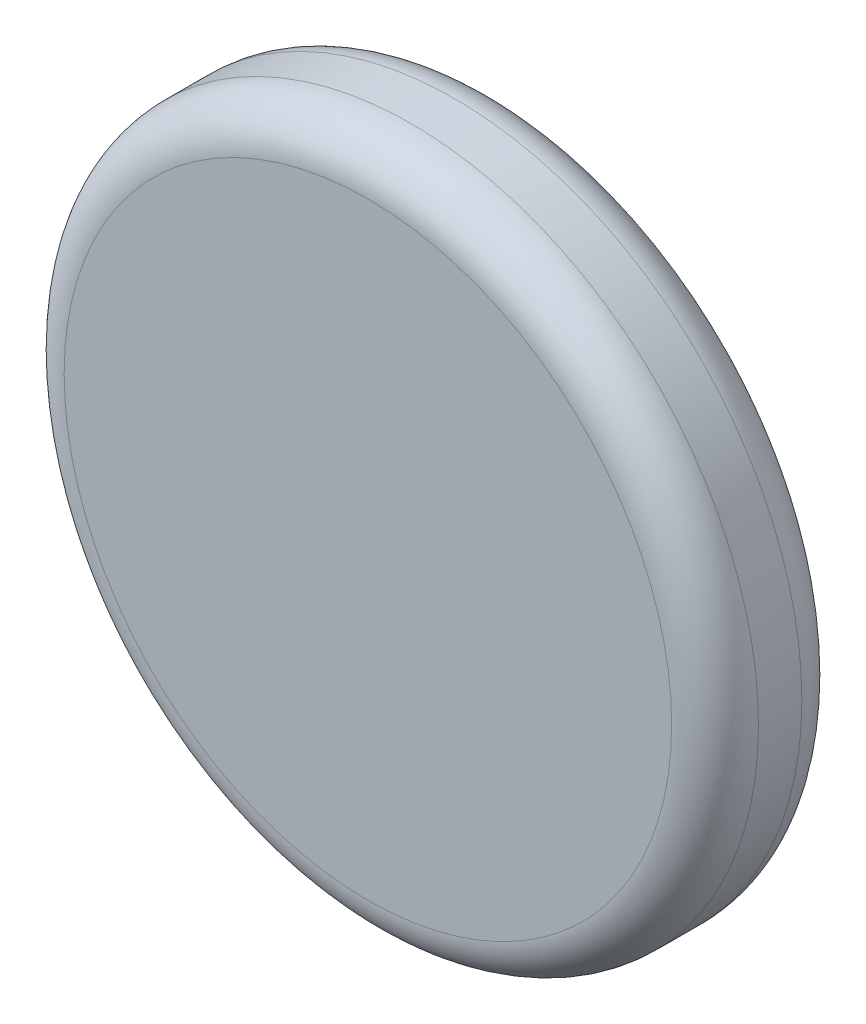
ISO-10303-21;
HEADER;
FILE_DESCRIPTION(('STEP AP214'),'2;1');
FILE_NAME('part.step','',(''),(''),'','','');
FILE_SCHEMA(('AUTOMOTIVE_DESIGN { 1 0 10303 214 1 1 1 1 }'));
ENDSEC;
DATA;
#1=APPLICATION_CONTEXT('core data for automotive mechanical design processes');
#2=APPLICATION_PROTOCOL_DEFINITION('international standard','automotive_design',2000,#1);
#3=PRODUCT_CONTEXT('',#1,'mechanical');
#4=PRODUCT('Part','Part','',(#3));
#5=PRODUCT_RELATED_PRODUCT_CATEGORY('part','',(#4));
#6=PRODUCT_DEFINITION_FORMATION('','',#4);
#7=PRODUCT_DEFINITION_CONTEXT('part definition',#1,'design');
#8=PRODUCT_DEFINITION('design','',#6,#7);
#9=PRODUCT_DEFINITION_SHAPE('','',#8);
#10=(LENGTH_UNIT() NAMED_UNIT(*) SI_UNIT(.MILLI.,.METRE.));
#11=(NAMED_UNIT(*) PLANE_ANGLE_UNIT() SI_UNIT($,.RADIAN.));
#12=(NAMED_UNIT(*) SI_UNIT($,.STERADIAN.) SOLID_ANGLE_UNIT());
#13=UNCERTAINTY_MEASURE_WITH_UNIT(LENGTH_MEASURE(1.E-05),#10,'distance_accuracy_value','');
#14=(GEOMETRIC_REPRESENTATION_CONTEXT(3) GLOBAL_UNCERTAINTY_ASSIGNED_CONTEXT((#13)) GLOBAL_UNIT_ASSIGNED_CONTEXT((#10,
#11,#12)) REPRESENTATION_CONTEXT('',''));
#15=CARTESIAN_POINT('',(0.,0.,0.));
#16=DIRECTION('',(0.,0.,1.));
#17=DIRECTION('',(1.,0.,0.));
#18=AXIS2_PLACEMENT_3D('',#15,#16,#17);
#19=CARTESIAN_POINT('',(0.,0.,0.3));
#20=DIRECTION('',(0.,0.,1.));
#21=DIRECTION('',(1.,0.,0.));
#22=AXIS2_PLACEMENT_3D('',#19,#20,#21);
#23=PLANE('',#22);
#24=CARTESIAN_POINT('',(0.,0.,0.3));
#25=DIRECTION('',(0.,0.,-1.));
#26=DIRECTION('',(-1.,0.,0.));
#27=AXIS2_PLACEMENT_3D('',#24,#25,#26);
#28=CIRCLE('',#27,0.7);
#29=CARTESIAN_POINT('',(0.7,0.,0.3));
#30=VERTEX_POINT('',#29);
#31=EDGE_CURVE('E11',#30,#30,#28,.T.);
#32=ORIENTED_EDGE('',*,*,#31,.F.);
#33=EDGE_LOOP('',(#32));
#34=FACE_BOUND('',#33,.T.);
#35=ADVANCED_FACE('F17',(#34),#23,.T.);
#36=CARTESIAN_POINT('',(0.,0.,0.2));
#37=DIRECTION('',(0.,0.,1.));
#38=DIRECTION('',(1.,0.,0.));
#39=AXIS2_PLACEMENT_3D('',#36,#37,#38);
#40=TOROIDAL_SURFACE('',#39,0.7,0.1);
#41=CARTESIAN_POINT('',(0.,0.,0.2));
#42=DIRECTION('',(0.,0.,1.));
#43=DIRECTION('',(-1.,0.,0.));
#44=AXIS2_PLACEMENT_3D('',#41,#42,#43);
#45=CIRCLE('',#44,0.8);
#46=CARTESIAN_POINT('',(0.8,0.,0.2));
#47=VERTEX_POINT('',#46);
#48=EDGE_CURVE('E57',#47,#47,#45,.T.);
#49=ORIENTED_EDGE('',*,*,#48,.T.);
#50=CARTESIAN_POINT('',(0.8,0.,0.2));
#51=CARTESIAN_POINT('',(0.8,0.,0.226733678315));
#52=CARTESIAN_POINT('',(0.791499564937,0.,0.252770857258));
#53=CARTESIAN_POINT('',(0.77519195132,0.,0.27519195132));
#54=CARTESIAN_POINT('',(0.752770857258,0.,0.291499564937));
#55=CARTESIAN_POINT('',(0.726733678315,0.,0.3));
#56=CARTESIAN_POINT('',(0.7,0.,0.3));
#57=(BOUNDED_CURVE() B_SPLINE_CURVE(6,(#50,#51,#52,#53,#54,#55,#56),.UNSPECIFIED.,.F.,
.F.) B_SPLINE_CURVE_WITH_KNOTS((7,7),(0.,1.570796326795),
.UNSPECIFIED.) CURVE() GEOMETRIC_REPRESENTATION_ITEM() RATIONAL_B_SPLINE_CURVE((1.031393471788,
1.010025407661,0.997924642725,0.993958444137,0.997924642725,1.010025407661,1.031393471788)) REPRESENTATION_ITEM(''));
#58=EDGE_CURVE('E25',#47,#30,#57,.T.);
#59=ORIENTED_EDGE('',*,*,#58,.T.);
#60=ORIENTED_EDGE('',*,*,#31,.T.);
#61=ORIENTED_EDGE('',*,*,#58,.F.);
#62=EDGE_LOOP('',(#49,#59,#60,#61));
#63=FACE_BOUND('',#62,.T.);
#64=ADVANCED_FACE('F92',(#63),#40,.T.);
#65=CARTESIAN_POINT('',(0.,0.,0.));
#66=DIRECTION('',(0.,0.,1.));
#67=DIRECTION('',(1.,0.,0.));
#68=AXIS2_PLACEMENT_3D('',#65,#66,#67);
#69=PLANE('',#68);
#70=CARTESIAN_POINT('',(0.,0.,0.));
#71=DIRECTION('',(0.,0.,1.));
#72=DIRECTION('',(-1.,0.,0.));
#73=AXIS2_PLACEMENT_3D('',#70,#71,#72);
#74=CIRCLE('',#73,0.7);
#75=CARTESIAN_POINT('',(0.7,0.,0.));
#76=VERTEX_POINT('',#75);
#77=EDGE_CURVE('E65',#76,#76,#74,.T.);
#78=ORIENTED_EDGE('',*,*,#77,.F.);
#79=EDGE_LOOP('',(#78));
#80=FACE_BOUND('',#79,.T.);
#81=ADVANCED_FACE('F94',(#80),#69,.F.);
#82=CARTESIAN_POINT('',(0.,0.,0.));
#83=DIRECTION('',(0.,0.,1.));
#84=DIRECTION('',(-1.,0.,0.));
#85=AXIS2_PLACEMENT_3D('',#82,#83,#84);
#86=CYLINDRICAL_SURFACE('',#85,0.8);
#87=ORIENTED_EDGE('',*,*,#48,.F.);
#88=CARTESIAN_POINT('',(0.8,0.,0.1));
#89=CARTESIAN_POINT('',(0.8,0.,0.2));
#90=(BOUNDED_CURVE() B_SPLINE_CURVE(1,(#88,#89),.UNSPECIFIED.,.F.,
.F.) B_SPLINE_CURVE_WITH_KNOTS((2,2),(0.1,0.2),
.UNSPECIFIED.) CURVE() GEOMETRIC_REPRESENTATION_ITEM() RATIONAL_B_SPLINE_CURVE((1.,1.)) REPRESENTATION_ITEM(''));
#91=CARTESIAN_POINT('',(0.8,0.,0.1));
#92=VERTEX_POINT('',#91);
#93=EDGE_CURVE('E52',#92,#47,#90,.T.);
#94=ORIENTED_EDGE('',*,*,#93,.F.);
#95=CARTESIAN_POINT('',(0.,0.,0.1));
#96=DIRECTION('',(0.,0.,-1.));
#97=DIRECTION('',(-1.,0.,0.));
#98=AXIS2_PLACEMENT_3D('',#95,#96,#97);
#99=CIRCLE('',#98,0.8);
#100=EDGE_CURVE('E56',#92,#92,#99,.T.);
#101=ORIENTED_EDGE('',*,*,#100,.F.);
#102=ORIENTED_EDGE('',*,*,#93,.T.);
#103=EDGE_LOOP('',(#87,#94,#101,#102));
#104=FACE_BOUND('',#103,.T.);
#105=ADVANCED_FACE('F54',(#104),#86,.T.);
#106=CARTESIAN_POINT('',(0.,0.,0.1));
#107=DIRECTION('',(0.,0.,-1.));
#108=DIRECTION('',(-1.,0.,0.));
#109=AXIS2_PLACEMENT_3D('',#106,#107,#108);
#110=TOROIDAL_SURFACE('',#109,0.7,0.1);
#111=ORIENTED_EDGE('',*,*,#100,.T.);
#112=CARTESIAN_POINT('',(0.8,0.,0.1));
#113=CARTESIAN_POINT('',(0.8,0.,0.07326632168471));
#114=CARTESIAN_POINT('',(0.791499564937,0.,0.04722914274178));
#115=CARTESIAN_POINT('',(0.77519195132,0.,0.02480804867977));
#116=CARTESIAN_POINT('',(0.752770857258,0.,0.008500435063369));
#117=CARTESIAN_POINT('',(0.726733678315,0.,0.));
#118=CARTESIAN_POINT('',(0.7,0.,0.));
#119=(BOUNDED_CURVE() B_SPLINE_CURVE(6,(#112,#113,#114,#115,#116,#117,#118),.UNSPECIFIED.,.F.,
.F.) B_SPLINE_CURVE_WITH_KNOTS((7,7),(0.,1.570796326795),
.UNSPECIFIED.) CURVE() GEOMETRIC_REPRESENTATION_ITEM() RATIONAL_B_SPLINE_CURVE((1.031393471788,
1.010025407661,0.997924642725,0.993958444137,0.997924642725,1.010025407661,1.031393471788)) REPRESENTATION_ITEM(''));
#120=EDGE_CURVE('E62',#92,#76,#119,.T.);
#121=ORIENTED_EDGE('',*,*,#120,.T.);
#122=ORIENTED_EDGE('',*,*,#77,.T.);
#123=ORIENTED_EDGE('',*,*,#120,.F.);
#124=EDGE_LOOP('',(#111,#121,#122,#123));
#125=FACE_BOUND('',#124,.T.);
#126=ADVANCED_FACE('F63',(#125),#110,.T.);
#127=CLOSED_SHELL('',(#35,#64,#81,#105,#126));
#128=MANIFOLD_SOLID_BREP('B1',#127);
#129=ADVANCED_BREP_SHAPE_REPRESENTATION('',(#18,#128),#14);
#130=SHAPE_DEFINITION_REPRESENTATION(#9,#129);
ENDSEC;
END-ISO-10303-21;
